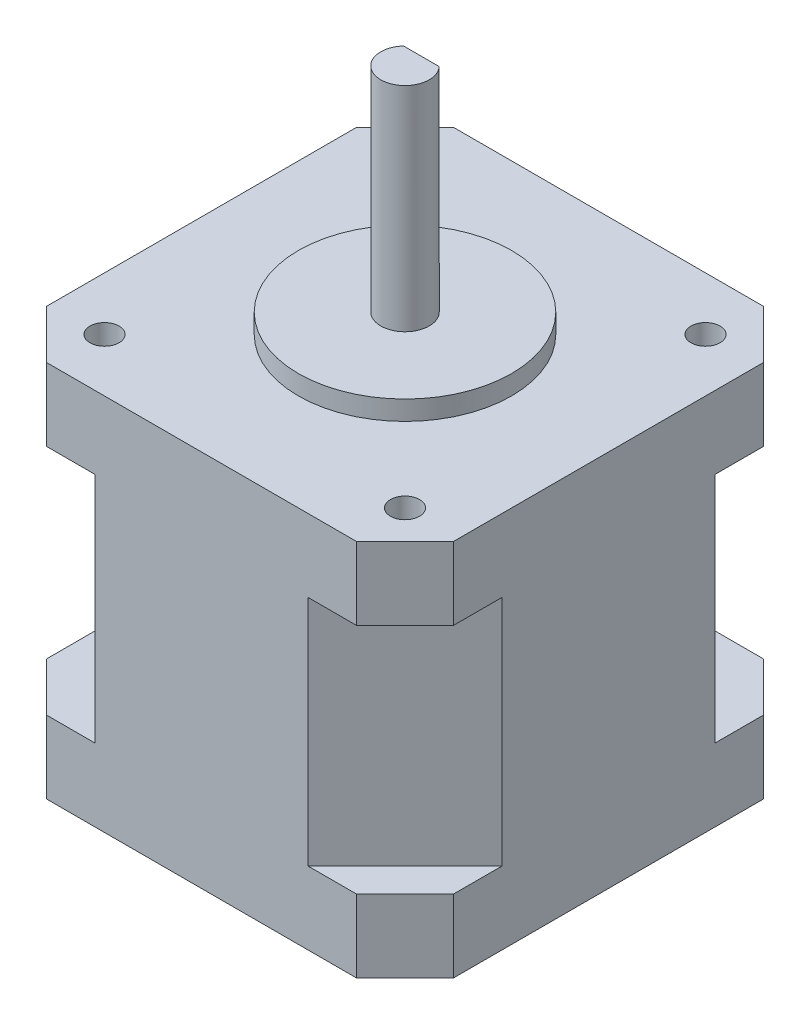
ISO-10303-21;
HEADER;
FILE_DESCRIPTION(('STEP AP214'),'2;1');
FILE_NAME('part.step','',(''),(''),'','','');
FILE_SCHEMA(('AUTOMOTIVE_DESIGN { 1 0 10303 214 1 1 1 1 }'));
ENDSEC;
DATA;
#1=APPLICATION_CONTEXT('core data for automotive mechanical design processes');
#2=APPLICATION_PROTOCOL_DEFINITION('international standard','automotive_design',2000,#1);
#3=PRODUCT_CONTEXT('',#1,'mechanical');
#4=PRODUCT('Part','Part','',(#3));
#5=PRODUCT_RELATED_PRODUCT_CATEGORY('part','',(#4));
#6=PRODUCT_DEFINITION_FORMATION('','',#4);
#7=PRODUCT_DEFINITION_CONTEXT('part definition',#1,'design');
#8=PRODUCT_DEFINITION('design','',#6,#7);
#9=PRODUCT_DEFINITION_SHAPE('','',#8);
#10=(LENGTH_UNIT() NAMED_UNIT(*) SI_UNIT(.MILLI.,.METRE.));
#11=(NAMED_UNIT(*) PLANE_ANGLE_UNIT() SI_UNIT($,.RADIAN.));
#12=(NAMED_UNIT(*) SI_UNIT($,.STERADIAN.) SOLID_ANGLE_UNIT());
#13=UNCERTAINTY_MEASURE_WITH_UNIT(LENGTH_MEASURE(1.E-05),#10,'distance_accuracy_value','');
#14=(GEOMETRIC_REPRESENTATION_CONTEXT(3) GLOBAL_UNCERTAINTY_ASSIGNED_CONTEXT((#13)) GLOBAL_UNIT_ASSIGNED_CONTEXT((#10,
#11,#12)) REPRESENTATION_CONTEXT('',''));
#15=CARTESIAN_POINT('',(0.,0.,0.));
#16=DIRECTION('',(0.,0.,1.));
#17=DIRECTION('',(1.,0.,0.));
#18=AXIS2_PLACEMENT_3D('',#15,#16,#17);
#19=CARTESIAN_POINT('',(0.,-7.5,0.));
#20=DIRECTION('',(0.,-1.,0.));
#21=DIRECTION('',(0.,0.,-1.));
#22=AXIS2_PLACEMENT_3D('',#19,#20,#21);
#23=PLANE('',#22);
#24=DIRECTION('',(-0.707106781186548,0.,-0.707106781186548));
#25=VECTOR('',#24,1.);
#26=CARTESIAN_POINT('',(-21.,-7.5,11.));
#27=LINE('',#26,#25);
#28=CARTESIAN_POINT('',(-11.,-7.5,21.));
#29=VERTEX_POINT('',#28);
#30=CARTESIAN_POINT('',(-21.,-7.5,11.));
#31=VERTEX_POINT('',#30);
#32=EDGE_CURVE('E352',#29,#31,#27,.T.);
#33=ORIENTED_EDGE('',*,*,#32,.F.);
#34=DIRECTION('',(1.,0.,0.));
#35=VECTOR('',#34,1.);
#36=CARTESIAN_POINT('',(-16.,-7.5,21.));
#37=LINE('',#36,#35);
#38=CARTESIAN_POINT('',(-16.,-7.5,21.));
#39=VERTEX_POINT('',#38);
#40=EDGE_CURVE('E419',#39,#29,#37,.T.);
#41=ORIENTED_EDGE('',*,*,#40,.F.);
#42=DIRECTION('',(0.707106781186548,0.,0.707106781186548));
#43=VECTOR('',#42,1.);
#44=CARTESIAN_POINT('',(-21.,-7.5,16.));
#45=LINE('',#44,#43);
#46=CARTESIAN_POINT('',(-21.,-7.5,16.));
#47=VERTEX_POINT('',#46);
#48=EDGE_CURVE('E414',#47,#39,#45,.T.);
#49=ORIENTED_EDGE('',*,*,#48,.F.);
#50=DIRECTION('',(0.,0.,1.));
#51=VECTOR('',#50,1.);
#52=CARTESIAN_POINT('',(-21.,-7.5,16.));
#53=LINE('',#52,#51);
#54=EDGE_CURVE('E415',#31,#47,#53,.T.);
#55=ORIENTED_EDGE('',*,*,#54,.F.);
#56=EDGE_LOOP('',(#33,#41,#49,#55));
#57=FACE_BOUND('',#56,.T.);
#58=ADVANCED_FACE('F51',(#57),#23,.T.);
#59=DIRECTION('',(-0.707106781186548,0.,0.707106781186547));
#60=VECTOR('',#59,1.);
#61=CARTESIAN_POINT('',(11.,-7.5,21.));
#62=LINE('',#61,#60);
#63=CARTESIAN_POINT('',(21.,-7.5,11.));
#64=VERTEX_POINT('',#63);
#65=CARTESIAN_POINT('',(11.,-7.5,21.));
#66=VERTEX_POINT('',#65);
#67=EDGE_CURVE('E372',#64,#66,#62,.T.);
#68=ORIENTED_EDGE('',*,*,#67,.F.);
#69=DIRECTION('',(0.,0.,-1.));
#70=VECTOR('',#69,1.);
#71=CARTESIAN_POINT('',(21.,-7.5,16.));
#72=LINE('',#71,#70);
#73=CARTESIAN_POINT('',(21.,-7.5,16.));
#74=VERTEX_POINT('',#73);
#75=EDGE_CURVE('E428',#74,#64,#72,.T.);
#76=ORIENTED_EDGE('',*,*,#75,.F.);
#77=DIRECTION('',(0.707106781186548,0.,-0.707106781186548));
#78=VECTOR('',#77,1.);
#79=CARTESIAN_POINT('',(16.,-7.5,21.));
#80=LINE('',#79,#78);
#81=CARTESIAN_POINT('',(16.,-7.5,21.));
#82=VERTEX_POINT('',#81);
#83=EDGE_CURVE('E423',#82,#74,#80,.T.);
#84=ORIENTED_EDGE('',*,*,#83,.F.);
#85=EDGE_CURVE('E75',#66,#82,#37,.T.);
#86=ORIENTED_EDGE('',*,*,#85,.F.);
#87=EDGE_LOOP('',(#68,#76,#84,#86));
#88=FACE_BOUND('',#87,.T.);
#89=ADVANCED_FACE('F583',(#88),#23,.T.);
#90=DIRECTION('',(0.707106781186547,0.,0.707106781186548));
#91=VECTOR('',#90,1.);
#92=CARTESIAN_POINT('',(11.,-7.5,-21.));
#93=LINE('',#92,#91);
#94=CARTESIAN_POINT('',(11.,-7.5,-21.));
#95=VERTEX_POINT('',#94);
#96=CARTESIAN_POINT('',(21.,-7.5,-11.));
#97=VERTEX_POINT('',#96);
#98=EDGE_CURVE('E368',#95,#97,#93,.T.);
#99=ORIENTED_EDGE('',*,*,#98,.F.);
#100=DIRECTION('',(-1.,0.,0.));
#101=VECTOR('',#100,1.);
#102=CARTESIAN_POINT('',(-16.,-7.5,-21.));
#103=LINE('',#102,#101);
#104=CARTESIAN_POINT('',(16.,-7.5,-21.));
#105=VERTEX_POINT('',#104);
#106=EDGE_CURVE('E437',#105,#95,#103,.T.);
#107=ORIENTED_EDGE('',*,*,#106,.F.);
#108=DIRECTION('',(-0.707106781186548,0.,-0.707106781186548));
#109=VECTOR('',#108,1.);
#110=CARTESIAN_POINT('',(16.,-7.5,-21.));
#111=LINE('',#110,#109);
#112=CARTESIAN_POINT('',(21.,-7.5,-16.));
#113=VERTEX_POINT('',#112);
#114=EDGE_CURVE('E432',#113,#105,#111,.T.);
#115=ORIENTED_EDGE('',*,*,#114,.F.);
#116=EDGE_CURVE('E427',#97,#113,#72,.T.);
#117=ORIENTED_EDGE('',*,*,#116,.F.);
#118=EDGE_LOOP('',(#99,#107,#115,#117));
#119=FACE_BOUND('',#118,.T.);
#120=ADVANCED_FACE('F549',(#119),#23,.T.);
#121=CARTESIAN_POINT('',(-21.,-7.5,16.));
#122=DIRECTION('',(-1.,0.,0.));
#123=DIRECTION('',(0.,0.,1.));
#124=AXIS2_PLACEMENT_3D('',#121,#122,#123);
#125=PLANE('',#124);
#126=DIRECTION('',(0.,0.,1.));
#127=VECTOR('',#126,1.);
#128=CARTESIAN_POINT('',(-21.,0.,16.));
#129=LINE('',#128,#127);
#130=CARTESIAN_POINT('',(-21.,0.,-16.));
#131=VERTEX_POINT('',#130);
#132=CARTESIAN_POINT('',(-21.,0.,16.));
#133=VERTEX_POINT('',#132);
#134=EDGE_CURVE('E409',#131,#133,#129,.T.);
#135=ORIENTED_EDGE('',*,*,#134,.F.);
#136=DIRECTION('',(0.,1.,0.));
#137=VECTOR('',#136,1.);
#138=CARTESIAN_POINT('',(-21.,-7.5,-16.));
#139=LINE('',#138,#137);
#140=CARTESIAN_POINT('',(-21.,-7.5,-16.));
#141=VERTEX_POINT('',#140);
#142=EDGE_CURVE('E257',#141,#131,#139,.T.);
#143=ORIENTED_EDGE('',*,*,#142,.F.);
#144=CARTESIAN_POINT('',(-21.,-7.5,-11.));
#145=VERTEX_POINT('',#144);
#146=EDGE_CURVE('E410',#141,#145,#53,.T.);
#147=ORIENTED_EDGE('',*,*,#146,.T.);
#148=DIRECTION('',(0.,1.,0.));
#149=VECTOR('',#148,1.);
#150=CARTESIAN_POINT('',(-21.,-31.5,-11.));
#151=LINE('',#150,#149);
#152=CARTESIAN_POINT('',(-21.,-31.5,-11.));
#153=VERTEX_POINT('',#152);
#154=EDGE_CURVE('E405',#153,#145,#151,.T.);
#155=ORIENTED_EDGE('',*,*,#154,.F.);
#156=DIRECTION('',(0.,0.,-1.));
#157=VECTOR('',#156,1.);
#158=CARTESIAN_POINT('',(-21.,-31.5,-16.));
#159=LINE('',#158,#157);
#160=CARTESIAN_POINT('',(-21.,-31.5,-16.));
#161=VERTEX_POINT('',#160);
#162=EDGE_CURVE('E246',#153,#161,#159,.T.);
#163=ORIENTED_EDGE('',*,*,#162,.T.);
#164=DIRECTION('',(0.,1.,0.));
#165=VECTOR('',#164,1.);
#166=CARTESIAN_POINT('',(-21.,-39.,-16.));
#167=LINE('',#166,#165);
#168=CARTESIAN_POINT('',(-21.,-39.,-16.));
#169=VERTEX_POINT('',#168);
#170=EDGE_CURVE('E342',#169,#161,#167,.T.);
#171=ORIENTED_EDGE('',*,*,#170,.F.);
#172=DIRECTION('',(0.,0.,-1.));
#173=VECTOR('',#172,1.);
#174=CARTESIAN_POINT('',(-21.,-39.,-16.));
#175=LINE('',#174,#173);
#176=CARTESIAN_POINT('',(-21.,-39.,16.));
#177=VERTEX_POINT('',#176);
#178=EDGE_CURVE('E258',#177,#169,#175,.T.);
#179=ORIENTED_EDGE('',*,*,#178,.F.);
#180=DIRECTION('',(0.,1.,0.));
#181=VECTOR('',#180,1.);
#182=CARTESIAN_POINT('',(-21.,-39.,16.));
#183=LINE('',#182,#181);
#184=CARTESIAN_POINT('',(-21.,-31.5,16.));
#185=VERTEX_POINT('',#184);
#186=EDGE_CURVE('E284',#177,#185,#183,.T.);
#187=ORIENTED_EDGE('',*,*,#186,.T.);
#188=CARTESIAN_POINT('',(-21.,-31.5,11.));
#189=VERTEX_POINT('',#188);
#190=EDGE_CURVE('E285',#185,#189,#159,.T.);
#191=ORIENTED_EDGE('',*,*,#190,.T.);
#192=DIRECTION('',(0.,1.,0.));
#193=VECTOR('',#192,1.);
#194=CARTESIAN_POINT('',(-21.,-31.5,11.));
#195=LINE('',#194,#193);
#196=EDGE_CURVE('E364',#189,#31,#195,.T.);
#197=ORIENTED_EDGE('',*,*,#196,.T.);
#198=ORIENTED_EDGE('',*,*,#54,.T.);
#199=DIRECTION('',(0.,1.,0.));
#200=VECTOR('',#199,1.);
#201=CARTESIAN_POINT('',(-21.,-7.5,16.));
#202=LINE('',#201,#200);
#203=EDGE_CURVE('E445',#47,#133,#202,.T.);
#204=ORIENTED_EDGE('',*,*,#203,.T.);
#205=EDGE_LOOP('',(#135,#143,#147,#155,#163,#171,#179,#187,#191,#197,#198,#204));
#206=FACE_BOUND('',#205,.T.);
#207=ADVANCED_FACE('F53',(#206),#125,.T.);
#208=CARTESIAN_POINT('',(-21.,-7.5,-16.));
#209=DIRECTION('',(-0.707106781186549,0.,-0.707106781186546));
#210=DIRECTION('',(-0.707106781186546,0.,0.707106781186549));
#211=AXIS2_PLACEMENT_3D('',#208,#209,#210);
#212=PLANE('',#211);
#213=DIRECTION('',(-0.707106781186546,0.,0.707106781186549));
#214=VECTOR('',#213,1.);
#215=CARTESIAN_POINT('',(-21.,0.,-16.));
#216=LINE('',#215,#214);
#217=CARTESIAN_POINT('',(-16.,0.,-21.));
#218=VERTEX_POINT('',#217);
#219=EDGE_CURVE('E473',#218,#131,#216,.T.);
#220=ORIENTED_EDGE('',*,*,#219,.F.);
#221=DIRECTION('',(0.,1.,0.));
#222=VECTOR('',#221,1.);
#223=CARTESIAN_POINT('',(-16.,-7.5,-21.));
#224=LINE('',#223,#222);
#225=CARTESIAN_POINT('',(-16.,-7.5,-21.));
#226=VERTEX_POINT('',#225);
#227=EDGE_CURVE('E479',#226,#218,#224,.T.);
#228=ORIENTED_EDGE('',*,*,#227,.F.);
#229=DIRECTION('',(-0.707106781186546,0.,0.707106781186549));
#230=VECTOR('',#229,1.);
#231=CARTESIAN_POINT('',(-21.,-7.5,-16.));
#232=LINE('',#231,#230);
#233=EDGE_CURVE('E441',#226,#141,#232,.T.);
#234=ORIENTED_EDGE('',*,*,#233,.T.);
#235=ORIENTED_EDGE('',*,*,#142,.T.);
#236=EDGE_LOOP('',(#220,#228,#234,#235));
#237=FACE_BOUND('',#236,.T.);
#238=ADVANCED_FACE('F512',(#237),#212,.T.);
#239=CARTESIAN_POINT('',(-16.,-7.5,-21.));
#240=DIRECTION('',(0.,0.,-1.));
#241=DIRECTION('',(-1.,0.,0.));
#242=AXIS2_PLACEMENT_3D('',#239,#240,#241);
#243=PLANE('',#242);
#244=DIRECTION('',(-1.,0.,0.));
#245=VECTOR('',#244,1.);
#246=CARTESIAN_POINT('',(-16.,0.,-21.));
#247=LINE('',#246,#245);
#248=CARTESIAN_POINT('',(16.,0.,-21.));
#249=VERTEX_POINT('',#248);
#250=EDGE_CURVE('E469',#249,#218,#247,.T.);
#251=ORIENTED_EDGE('',*,*,#250,.F.);
#252=DIRECTION('',(0.,1.,0.));
#253=VECTOR('',#252,1.);
#254=CARTESIAN_POINT('',(16.,-7.5,-21.));
#255=LINE('',#254,#253);
#256=EDGE_CURVE('E482',#105,#249,#255,.T.);
#257=ORIENTED_EDGE('',*,*,#256,.F.);
#258=ORIENTED_EDGE('',*,*,#106,.T.);
#259=DIRECTION('',(0.,1.,0.));
#260=VECTOR('',#259,1.);
#261=CARTESIAN_POINT('',(11.,-31.5,-21.));
#262=LINE('',#261,#260);
#263=CARTESIAN_POINT('',(11.,-31.5,-21.));
#264=VERTEX_POINT('',#263);
#265=EDGE_CURVE('E397',#264,#95,#262,.T.);
#266=ORIENTED_EDGE('',*,*,#265,.F.);
#267=DIRECTION('',(1.,0.,0.));
#268=VECTOR('',#267,1.);
#269=CARTESIAN_POINT('',(-16.,-31.5,-21.));
#270=LINE('',#269,#268);
#271=CARTESIAN_POINT('',(16.,-31.5,-21.));
#272=VERTEX_POINT('',#271);
#273=EDGE_CURVE('E292',#264,#272,#270,.T.);
#274=ORIENTED_EDGE('',*,*,#273,.T.);
#275=DIRECTION('',(0.,1.,0.));
#276=VECTOR('',#275,1.);
#277=CARTESIAN_POINT('',(16.,-39.,-21.));
#278=LINE('',#277,#276);
#279=CARTESIAN_POINT('',(16.,-39.,-21.));
#280=VERTEX_POINT('',#279);
#281=EDGE_CURVE('E334',#280,#272,#278,.T.);
#282=ORIENTED_EDGE('',*,*,#281,.F.);
#283=DIRECTION('',(1.,0.,0.));
#284=VECTOR('',#283,1.);
#285=CARTESIAN_POINT('',(-16.,-39.,-21.));
#286=LINE('',#285,#284);
#287=CARTESIAN_POINT('',(-16.,-39.,-21.));
#288=VERTEX_POINT('',#287);
#289=EDGE_CURVE('E266',#288,#280,#286,.T.);
#290=ORIENTED_EDGE('',*,*,#289,.F.);
#291=DIRECTION('',(0.,1.,0.));
#292=VECTOR('',#291,1.);
#293=CARTESIAN_POINT('',(-16.,-39.,-21.));
#294=LINE('',#293,#292);
#295=CARTESIAN_POINT('',(-16.,-31.5,-21.));
#296=VERTEX_POINT('',#295);
#297=EDGE_CURVE('E338',#288,#296,#294,.T.);
#298=ORIENTED_EDGE('',*,*,#297,.T.);
#299=CARTESIAN_POINT('',(-11.,-31.5,-21.));
#300=VERTEX_POINT('',#299);
#301=EDGE_CURVE('E293',#296,#300,#270,.T.);
#302=ORIENTED_EDGE('',*,*,#301,.T.);
#303=DIRECTION('',(0.,1.,0.));
#304=VECTOR('',#303,1.);
#305=CARTESIAN_POINT('',(-11.,-31.5,-21.));
#306=LINE('',#305,#304);
#307=CARTESIAN_POINT('',(-11.,-7.5,-21.));
#308=VERTEX_POINT('',#307);
#309=EDGE_CURVE('E401',#300,#308,#306,.T.);
#310=ORIENTED_EDGE('',*,*,#309,.T.);
#311=EDGE_CURVE('E436',#308,#226,#103,.T.);
#312=ORIENTED_EDGE('',*,*,#311,.T.);
#313=ORIENTED_EDGE('',*,*,#227,.T.);
#314=EDGE_LOOP('',(#251,#257,#258,#266,#274,#282,#290,#298,#302,#310,#312,#313));
#315=FACE_BOUND('',#314,.T.);
#316=ADVANCED_FACE('F521',(#315),#243,.T.);
#317=CARTESIAN_POINT('',(16.,-7.5,-21.));
#318=DIRECTION('',(0.707106781186547,0.,-0.707106781186547));
#319=DIRECTION('',(-0.707106781186548,0.,-0.707106781186548));
#320=AXIS2_PLACEMENT_3D('',#317,#318,#319);
#321=PLANE('',#320);
#322=DIRECTION('',(-0.707106781186548,0.,-0.707106781186548));
#323=VECTOR('',#322,1.);
#324=CARTESIAN_POINT('',(16.,0.,-21.));
#325=LINE('',#324,#323);
#326=CARTESIAN_POINT('',(21.,0.,-16.));
#327=VERTEX_POINT('',#326);
#328=EDGE_CURVE('E465',#327,#249,#325,.T.);
#329=ORIENTED_EDGE('',*,*,#328,.F.);
#330=DIRECTION('',(0.,1.,0.));
#331=VECTOR('',#330,1.);
#332=CARTESIAN_POINT('',(21.,-7.5,-16.));
#333=LINE('',#332,#331);
#334=EDGE_CURVE('E485',#113,#327,#333,.T.);
#335=ORIENTED_EDGE('',*,*,#334,.F.);
#336=ORIENTED_EDGE('',*,*,#114,.T.);
#337=ORIENTED_EDGE('',*,*,#256,.T.);
#338=EDGE_LOOP('',(#329,#335,#336,#337));
#339=FACE_BOUND('',#338,.T.);
#340=ADVANCED_FACE('F547',(#339),#321,.T.);
#341=CARTESIAN_POINT('',(21.,-7.5,16.));
#342=DIRECTION('',(1.,0.,0.));
#343=DIRECTION('',(0.,0.,-1.));
#344=AXIS2_PLACEMENT_3D('',#341,#342,#343);
#345=PLANE('',#344);
#346=DIRECTION('',(0.,0.,-1.));
#347=VECTOR('',#346,1.);
#348=CARTESIAN_POINT('',(21.,0.,16.));
#349=LINE('',#348,#347);
#350=CARTESIAN_POINT('',(21.,0.,16.));
#351=VERTEX_POINT('',#350);
#352=EDGE_CURVE('E461',#351,#327,#349,.T.);
#353=ORIENTED_EDGE('',*,*,#352,.F.);
#354=DIRECTION('',(0.,1.,0.));
#355=VECTOR('',#354,1.);
#356=CARTESIAN_POINT('',(21.,-7.5,16.));
#357=LINE('',#356,#355);
#358=EDGE_CURVE('E488',#74,#351,#357,.T.);
#359=ORIENTED_EDGE('',*,*,#358,.F.);
#360=ORIENTED_EDGE('',*,*,#75,.T.);
#361=DIRECTION('',(0.,1.,0.));
#362=VECTOR('',#361,1.);
#363=CARTESIAN_POINT('',(21.,-31.5,11.));
#364=LINE('',#363,#362);
#365=CARTESIAN_POINT('',(21.,-31.5,11.));
#366=VERTEX_POINT('',#365);
#367=EDGE_CURVE('E389',#366,#64,#364,.T.);
#368=ORIENTED_EDGE('',*,*,#367,.F.);
#369=DIRECTION('',(0.,0.,1.));
#370=VECTOR('',#369,1.);
#371=CARTESIAN_POINT('',(21.,-31.5,-16.));
#372=LINE('',#371,#370);
#373=CARTESIAN_POINT('',(21.,-31.5,16.));
#374=VERTEX_POINT('',#373);
#375=EDGE_CURVE('E300',#366,#374,#372,.T.);
#376=ORIENTED_EDGE('',*,*,#375,.T.);
#377=DIRECTION('',(0.,1.,0.));
#378=VECTOR('',#377,1.);
#379=CARTESIAN_POINT('',(21.,-39.,16.));
#380=LINE('',#379,#378);
#381=CARTESIAN_POINT('',(21.,-39.,16.));
#382=VERTEX_POINT('',#381);
#383=EDGE_CURVE('E326',#382,#374,#380,.T.);
#384=ORIENTED_EDGE('',*,*,#383,.F.);
#385=DIRECTION('',(0.,0.,1.));
#386=VECTOR('',#385,1.);
#387=CARTESIAN_POINT('',(21.,-39.,-16.));
#388=LINE('',#387,#386);
#389=CARTESIAN_POINT('',(21.,-39.,-16.));
#390=VERTEX_POINT('',#389);
#391=EDGE_CURVE('E272',#390,#382,#388,.T.);
#392=ORIENTED_EDGE('',*,*,#391,.F.);
#393=DIRECTION('',(0.,1.,0.));
#394=VECTOR('',#393,1.);
#395=CARTESIAN_POINT('',(21.,-39.,-16.));
#396=LINE('',#395,#394);
#397=CARTESIAN_POINT('',(21.,-31.5,-16.));
#398=VERTEX_POINT('',#397);
#399=EDGE_CURVE('E330',#390,#398,#396,.T.);
#400=ORIENTED_EDGE('',*,*,#399,.T.);
#401=CARTESIAN_POINT('',(21.,-31.5,-11.));
#402=VERTEX_POINT('',#401);
#403=EDGE_CURVE('E301',#398,#402,#372,.T.);
#404=ORIENTED_EDGE('',*,*,#403,.T.);
#405=DIRECTION('',(0.,1.,0.));
#406=VECTOR('',#405,1.);
#407=CARTESIAN_POINT('',(21.,-31.5,-11.));
#408=LINE('',#407,#406);
#409=EDGE_CURVE('E393',#402,#97,#408,.T.);
#410=ORIENTED_EDGE('',*,*,#409,.T.);
#411=ORIENTED_EDGE('',*,*,#116,.T.);
#412=ORIENTED_EDGE('',*,*,#334,.T.);
#413=EDGE_LOOP('',(#353,#359,#360,#368,#376,#384,#392,#400,#404,#410,#411,#412));
#414=FACE_BOUND('',#413,.T.);
#415=ADVANCED_FACE('F542',(#414),#345,.T.);
#416=CARTESIAN_POINT('',(16.,-7.5,21.));
#417=DIRECTION('',(0.707106781186547,0.,0.707106781186547));
#418=DIRECTION('',(0.707106781186548,0.,-0.707106781186548));
#419=AXIS2_PLACEMENT_3D('',#416,#417,#418);
#420=PLANE('',#419);
#421=DIRECTION('',(0.707106781186548,0.,-0.707106781186548));
#422=VECTOR('',#421,1.);
#423=CARTESIAN_POINT('',(16.,0.,21.));
#424=LINE('',#423,#422);
#425=CARTESIAN_POINT('',(16.,0.,21.));
#426=VERTEX_POINT('',#425);
#427=EDGE_CURVE('E457',#426,#351,#424,.T.);
#428=ORIENTED_EDGE('',*,*,#427,.F.);
#429=DIRECTION('',(0.,1.,0.));
#430=VECTOR('',#429,1.);
#431=CARTESIAN_POINT('',(16.,-7.5,21.));
#432=LINE('',#431,#430);
#433=EDGE_CURVE('E491',#82,#426,#432,.T.);
#434=ORIENTED_EDGE('',*,*,#433,.F.);
#435=ORIENTED_EDGE('',*,*,#83,.T.);
#436=ORIENTED_EDGE('',*,*,#358,.T.);
#437=EDGE_LOOP('',(#428,#434,#435,#436));
#438=FACE_BOUND('',#437,.T.);
#439=ADVANCED_FACE('F615',(#438),#420,.T.);
#440=CARTESIAN_POINT('',(-16.,-7.5,21.));
#441=DIRECTION('',(0.,0.,1.));
#442=DIRECTION('',(1.,0.,0.));
#443=AXIS2_PLACEMENT_3D('',#440,#441,#442);
#444=PLANE('',#443);
#445=DIRECTION('',(1.,0.,0.));
#446=VECTOR('',#445,1.);
#447=CARTESIAN_POINT('',(-16.,0.,21.));
#448=LINE('',#447,#446);
#449=CARTESIAN_POINT('',(-16.,0.,21.));
#450=VERTEX_POINT('',#449);
#451=EDGE_CURVE('E453',#450,#426,#448,.T.);
#452=ORIENTED_EDGE('',*,*,#451,.F.);
#453=DIRECTION('',(0.,1.,0.));
#454=VECTOR('',#453,1.);
#455=CARTESIAN_POINT('',(-16.,-7.5,21.));
#456=LINE('',#455,#454);
#457=EDGE_CURVE('E494',#39,#450,#456,.T.);
#458=ORIENTED_EDGE('',*,*,#457,.F.);
#459=ORIENTED_EDGE('',*,*,#40,.T.);
#460=DIRECTION('',(0.,1.,0.));
#461=VECTOR('',#460,1.);
#462=CARTESIAN_POINT('',(-11.,-31.5,21.));
#463=LINE('',#462,#461);
#464=CARTESIAN_POINT('',(-11.,-31.5,21.));
#465=VERTEX_POINT('',#464);
#466=EDGE_CURVE('E381',#465,#29,#463,.T.);
#467=ORIENTED_EDGE('',*,*,#466,.F.);
#468=DIRECTION('',(-1.,0.,0.));
#469=VECTOR('',#468,1.);
#470=CARTESIAN_POINT('',(-16.,-31.5,21.));
#471=LINE('',#470,#469);
#472=CARTESIAN_POINT('',(-16.,-31.5,21.));
#473=VERTEX_POINT('',#472);
#474=EDGE_CURVE('E308',#465,#473,#471,.T.);
#475=ORIENTED_EDGE('',*,*,#474,.T.);
#476=DIRECTION('',(0.,1.,0.));
#477=VECTOR('',#476,1.);
#478=CARTESIAN_POINT('',(-16.,-39.,21.));
#479=LINE('',#478,#477);
#480=CARTESIAN_POINT('',(-16.,-39.,21.));
#481=VERTEX_POINT('',#480);
#482=EDGE_CURVE('E318',#481,#473,#479,.T.);
#483=ORIENTED_EDGE('',*,*,#482,.F.);
#484=DIRECTION('',(-1.,0.,0.));
#485=VECTOR('',#484,1.);
#486=CARTESIAN_POINT('',(-16.,-39.,21.));
#487=LINE('',#486,#485);
#488=CARTESIAN_POINT('',(16.,-39.,21.));
#489=VERTEX_POINT('',#488);
#490=EDGE_CURVE('E278',#489,#481,#487,.T.);
#491=ORIENTED_EDGE('',*,*,#490,.F.);
#492=DIRECTION('',(0.,1.,0.));
#493=VECTOR('',#492,1.);
#494=CARTESIAN_POINT('',(16.,-39.,21.));
#495=LINE('',#494,#493);
#496=CARTESIAN_POINT('',(16.,-31.5,21.));
#497=VERTEX_POINT('',#496);
#498=EDGE_CURVE('E322',#489,#497,#495,.T.);
#499=ORIENTED_EDGE('',*,*,#498,.T.);
#500=CARTESIAN_POINT('',(11.,-31.5,21.));
#501=VERTEX_POINT('',#500);
#502=EDGE_CURVE('E309',#497,#501,#471,.T.);
#503=ORIENTED_EDGE('',*,*,#502,.T.);
#504=DIRECTION('',(0.,1.,0.));
#505=VECTOR('',#504,1.);
#506=CARTESIAN_POINT('',(11.,-31.5,21.));
#507=LINE('',#506,#505);
#508=EDGE_CURVE('E385',#501,#66,#507,.T.);
#509=ORIENTED_EDGE('',*,*,#508,.T.);
#510=ORIENTED_EDGE('',*,*,#85,.T.);
#511=ORIENTED_EDGE('',*,*,#433,.T.);
#512=EDGE_LOOP('',(#452,#458,#459,#467,#475,#483,#491,#499,#503,#509,#510,#511));
#513=FACE_BOUND('',#512,.T.);
#514=ADVANCED_FACE('F597',(#513),#444,.T.);
#515=CARTESIAN_POINT('',(-21.,-7.5,16.));
#516=DIRECTION('',(-0.707106781186547,0.,0.707106781186547));
#517=DIRECTION('',(0.707106781186548,0.,0.707106781186548));
#518=AXIS2_PLACEMENT_3D('',#515,#516,#517);
#519=PLANE('',#518);
#520=DIRECTION('',(0.707106781186548,0.,0.707106781186548));
#521=VECTOR('',#520,1.);
#522=CARTESIAN_POINT('',(-21.,0.,16.));
#523=LINE('',#522,#521);
#524=EDGE_CURVE('E449',#133,#450,#523,.T.);
#525=ORIENTED_EDGE('',*,*,#524,.F.);
#526=ORIENTED_EDGE('',*,*,#203,.F.);
#527=ORIENTED_EDGE('',*,*,#48,.T.);
#528=ORIENTED_EDGE('',*,*,#457,.T.);
#529=EDGE_LOOP('',(#525,#526,#527,#528));
#530=FACE_BOUND('',#529,.T.);
#531=ADVANCED_FACE('F504',(#530),#519,.T.);
#532=DIRECTION('',(0.707106781186548,0.,-0.707106781186548));
#533=VECTOR('',#532,1.);
#534=CARTESIAN_POINT('',(-21.,-7.5,-11.));
#535=LINE('',#534,#533);
#536=EDGE_CURVE('E346',#145,#308,#535,.T.);
#537=ORIENTED_EDGE('',*,*,#536,.F.);
#538=ORIENTED_EDGE('',*,*,#146,.F.);
#539=ORIENTED_EDGE('',*,*,#233,.F.);
#540=ORIENTED_EDGE('',*,*,#311,.F.);
#541=EDGE_LOOP('',(#537,#538,#539,#540));
#542=FACE_BOUND('',#541,.T.);
#543=ADVANCED_FACE('F517',(#542),#23,.T.);
#544=CARTESIAN_POINT('',(0.,0.,0.));
#545=DIRECTION('',(0.,-1.,0.));
#546=DIRECTION('',(0.,0.,-1.));
#547=AXIS2_PLACEMENT_3D('',#544,#545,#546);
#548=PLANE('',#547);
#549=CARTESIAN_POINT('',(-15.5000000000002,0.,15.4999999999998));
#550=DIRECTION('',(0.,1.,0.));
#551=DIRECTION('',(0.,0.,1.));
#552=AXIS2_PLACEMENT_3D('',#549,#550,#551);
#553=CIRCLE('',#552,1.5);
#554=CARTESIAN_POINT('',(-15.5000000000002,0.,16.9999999999998));
#555=VERTEX_POINT('',#554);
#556=EDGE_CURVE('E1130',#555,#555,#553,.T.);
#557=ORIENTED_EDGE('',*,*,#556,.F.);
#558=EDGE_LOOP('',(#557));
#559=FACE_BOUND('',#558,.T.);
#560=CARTESIAN_POINT('',(15.4999999999999,0.,15.5000000000001));
#561=DIRECTION('',(0.,1.,0.));
#562=DIRECTION('',(0.,0.,1.));
#563=AXIS2_PLACEMENT_3D('',#560,#561,#562);
#564=CIRCLE('',#563,1.5);
#565=CARTESIAN_POINT('',(15.4999999999999,0.,17.0000000000001));
#566=VERTEX_POINT('',#565);
#567=EDGE_CURVE('E1155',#566,#566,#564,.T.);
#568=ORIENTED_EDGE('',*,*,#567,.F.);
#569=EDGE_LOOP('',(#568));
#570=FACE_BOUND('',#569,.T.);
#571=CARTESIAN_POINT('',(15.5000000000001,0.,-15.4999999999999));
#572=DIRECTION('',(0.,1.,0.));
#573=DIRECTION('',(0.,0.,1.));
#574=AXIS2_PLACEMENT_3D('',#571,#572,#573);
#575=CIRCLE('',#574,1.5);
#576=CARTESIAN_POINT('',(15.5000000000001,0.,-13.9999999999999));
#577=VERTEX_POINT('',#576);
#578=EDGE_CURVE('E1146',#577,#577,#575,.T.);
#579=ORIENTED_EDGE('',*,*,#578,.F.);
#580=EDGE_LOOP('',(#579));
#581=FACE_BOUND('',#580,.T.);
#582=CARTESIAN_POINT('',(-15.5,0.,-15.5));
#583=DIRECTION('',(0.,1.,0.));
#584=DIRECTION('',(0.,0.,1.));
#585=AXIS2_PLACEMENT_3D('',#582,#583,#584);
#586=CIRCLE('',#585,1.5);
#587=CARTESIAN_POINT('',(-15.5,0.,-14.));
#588=VERTEX_POINT('',#587);
#589=EDGE_CURVE('E1142',#588,#588,#586,.T.);
#590=ORIENTED_EDGE('',*,*,#589,.F.);
#591=EDGE_LOOP('',(#590));
#592=FACE_BOUND('',#591,.T.);
#593=CARTESIAN_POINT('',(0.,0.,0.));
#594=DIRECTION('',(0.,1.,0.));
#595=DIRECTION('',(0.,0.,1.));
#596=AXIS2_PLACEMENT_3D('',#593,#594,#595);
#597=CIRCLE('',#596,11.);
#598=CARTESIAN_POINT('',(0.,0.,11.));
#599=VERTEX_POINT('',#598);
#600=EDGE_CURVE('E252',#599,#599,#597,.T.);
#601=ORIENTED_EDGE('',*,*,#600,.F.);
#602=EDGE_LOOP('',(#601));
#603=FACE_BOUND('',#602,.T.);
#604=ORIENTED_EDGE('',*,*,#134,.T.);
#605=ORIENTED_EDGE('',*,*,#524,.T.);
#606=ORIENTED_EDGE('',*,*,#451,.T.);
#607=ORIENTED_EDGE('',*,*,#427,.T.);
#608=ORIENTED_EDGE('',*,*,#352,.T.);
#609=ORIENTED_EDGE('',*,*,#328,.T.);
#610=ORIENTED_EDGE('',*,*,#250,.T.);
#611=ORIENTED_EDGE('',*,*,#219,.T.);
#612=EDGE_LOOP('',(#604,#605,#606,#607,#608,#609,#610,#611));
#613=FACE_BOUND('',#612,.T.);
#614=ADVANCED_FACE('F507',(#559,#570,#581,#592,#603,#613),#548,.F.);
#615=CARTESIAN_POINT('',(-21.,-31.5,-11.));
#616=DIRECTION('',(0.707106781186547,0.,0.707106781186547));
#617=DIRECTION('',(0.707106781186548,0.,-0.707106781186548));
#618=AXIS2_PLACEMENT_3D('',#615,#616,#617);
#619=PLANE('',#618);
#620=ORIENTED_EDGE('',*,*,#536,.T.);
#621=ORIENTED_EDGE('',*,*,#309,.F.);
#622=DIRECTION('',(0.707106781186548,0.,-0.707106781186548));
#623=VECTOR('',#622,1.);
#624=CARTESIAN_POINT('',(-21.,-31.5,-11.));
#625=LINE('',#624,#623);
#626=EDGE_CURVE('E347',#153,#300,#625,.T.);
#627=ORIENTED_EDGE('',*,*,#626,.F.);
#628=ORIENTED_EDGE('',*,*,#154,.T.);
#629=EDGE_LOOP('',(#620,#621,#627,#628));
#630=FACE_BOUND('',#629,.T.);
#631=ADVANCED_FACE('F519',(#630),#619,.F.);
#632=CARTESIAN_POINT('',(11.,-31.5,-21.));
#633=DIRECTION('',(-0.707106781186548,0.,0.707106781186547));
#634=DIRECTION('',(0.707106781186547,0.,0.707106781186548));
#635=AXIS2_PLACEMENT_3D('',#632,#633,#634);
#636=PLANE('',#635);
#637=ORIENTED_EDGE('',*,*,#98,.T.);
#638=ORIENTED_EDGE('',*,*,#409,.F.);
#639=DIRECTION('',(0.707106781186547,0.,0.707106781186548));
#640=VECTOR('',#639,1.);
#641=CARTESIAN_POINT('',(11.,-31.5,-21.));
#642=LINE('',#641,#640);
#643=EDGE_CURVE('E351',#264,#402,#642,.T.);
#644=ORIENTED_EDGE('',*,*,#643,.F.);
#645=ORIENTED_EDGE('',*,*,#265,.T.);
#646=EDGE_LOOP('',(#637,#638,#644,#645));
#647=FACE_BOUND('',#646,.T.);
#648=ADVANCED_FACE('F552',(#647),#636,.F.);
#649=CARTESIAN_POINT('',(11.,-31.5,21.));
#650=DIRECTION('',(-0.707106781186547,0.,-0.707106781186548));
#651=DIRECTION('',(-0.707106781186548,0.,0.707106781186547));
#652=AXIS2_PLACEMENT_3D('',#649,#650,#651);
#653=PLANE('',#652);
#654=ORIENTED_EDGE('',*,*,#67,.T.);
#655=ORIENTED_EDGE('',*,*,#508,.F.);
#656=DIRECTION('',(-0.707106781186548,0.,0.707106781186547));
#657=VECTOR('',#656,1.);
#658=CARTESIAN_POINT('',(11.,-31.5,21.));
#659=LINE('',#658,#657);
#660=EDGE_CURVE('E356',#366,#501,#659,.T.);
#661=ORIENTED_EDGE('',*,*,#660,.F.);
#662=ORIENTED_EDGE('',*,*,#367,.T.);
#663=EDGE_LOOP('',(#654,#655,#661,#662));
#664=FACE_BOUND('',#663,.T.);
#665=ADVANCED_FACE('F628',(#664),#653,.F.);
#666=CARTESIAN_POINT('',(-21.,-31.5,11.));
#667=DIRECTION('',(0.707106781186547,0.,-0.707106781186547));
#668=DIRECTION('',(-0.707106781186548,0.,-0.707106781186548));
#669=AXIS2_PLACEMENT_3D('',#666,#667,#668);
#670=PLANE('',#669);
#671=ORIENTED_EDGE('',*,*,#32,.T.);
#672=ORIENTED_EDGE('',*,*,#196,.F.);
#673=DIRECTION('',(-0.707106781186548,0.,-0.707106781186548));
#674=VECTOR('',#673,1.);
#675=CARTESIAN_POINT('',(-21.,-31.5,11.));
#676=LINE('',#675,#674);
#677=EDGE_CURVE('E360',#465,#189,#676,.T.);
#678=ORIENTED_EDGE('',*,*,#677,.F.);
#679=ORIENTED_EDGE('',*,*,#466,.T.);
#680=EDGE_LOOP('',(#671,#672,#678,#679));
#681=FACE_BOUND('',#680,.T.);
#682=ADVANCED_FACE('F648',(#681),#670,.F.);
#683=CARTESIAN_POINT('',(0.,-31.5,0.));
#684=DIRECTION('',(0.,1.,0.));
#685=DIRECTION('',(0.,0.,1.));
#686=AXIS2_PLACEMENT_3D('',#683,#684,#685);
#687=PLANE('',#686);
#688=ORIENTED_EDGE('',*,*,#162,.F.);
#689=ORIENTED_EDGE('',*,*,#626,.T.);
#690=ORIENTED_EDGE('',*,*,#301,.F.);
#691=DIRECTION('',(0.707106781186548,0.,-0.707106781186548));
#692=VECTOR('',#691,1.);
#693=CARTESIAN_POINT('',(-21.,-31.5,-16.));
#694=LINE('',#693,#692);
#695=EDGE_CURVE('E289',#161,#296,#694,.T.);
#696=ORIENTED_EDGE('',*,*,#695,.F.);
#697=EDGE_LOOP('',(#688,#689,#690,#696));
#698=FACE_BOUND('',#697,.T.);
#699=ADVANCED_FACE('F528',(#698),#687,.T.);
#700=ORIENTED_EDGE('',*,*,#273,.F.);
#701=ORIENTED_EDGE('',*,*,#643,.T.);
#702=ORIENTED_EDGE('',*,*,#403,.F.);
#703=DIRECTION('',(0.707106781186548,0.,0.707106781186548));
#704=VECTOR('',#703,1.);
#705=CARTESIAN_POINT('',(16.,-31.5,-21.));
#706=LINE('',#705,#704);
#707=EDGE_CURVE('E297',#272,#398,#706,.T.);
#708=ORIENTED_EDGE('',*,*,#707,.F.);
#709=EDGE_LOOP('',(#700,#701,#702,#708));
#710=FACE_BOUND('',#709,.T.);
#711=ADVANCED_FACE('F557',(#710),#687,.T.);
#712=ORIENTED_EDGE('',*,*,#375,.F.);
#713=ORIENTED_EDGE('',*,*,#660,.T.);
#714=ORIENTED_EDGE('',*,*,#502,.F.);
#715=DIRECTION('',(-0.707106781186548,0.,0.707106781186548));
#716=VECTOR('',#715,1.);
#717=CARTESIAN_POINT('',(16.,-31.5,21.));
#718=LINE('',#717,#716);
#719=EDGE_CURVE('E305',#374,#497,#718,.T.);
#720=ORIENTED_EDGE('',*,*,#719,.F.);
#721=EDGE_LOOP('',(#712,#713,#714,#720));
#722=FACE_BOUND('',#721,.T.);
#723=ADVANCED_FACE('F570',(#722),#687,.T.);
#724=CARTESIAN_POINT('',(-21.,-39.,-16.));
#725=DIRECTION('',(0.707106781186547,0.,0.707106781186547));
#726=DIRECTION('',(0.707106781186548,0.,-0.707106781186548));
#727=AXIS2_PLACEMENT_3D('',#724,#725,#726);
#728=PLANE('',#727);
#729=ORIENTED_EDGE('',*,*,#695,.T.);
#730=ORIENTED_EDGE('',*,*,#297,.F.);
#731=DIRECTION('',(0.707106781186548,0.,-0.707106781186548));
#732=VECTOR('',#731,1.);
#733=CARTESIAN_POINT('',(-21.,-39.,-16.));
#734=LINE('',#733,#732);
#735=EDGE_CURVE('E262',#169,#288,#734,.T.);
#736=ORIENTED_EDGE('',*,*,#735,.F.);
#737=ORIENTED_EDGE('',*,*,#170,.T.);
#738=EDGE_LOOP('',(#729,#730,#736,#737));
#739=FACE_BOUND('',#738,.T.);
#740=ADVANCED_FACE('F568',(#739),#728,.F.);
#741=CARTESIAN_POINT('',(16.,-39.,-21.));
#742=DIRECTION('',(-0.707106781186547,0.,0.707106781186547));
#743=DIRECTION('',(0.707106781186548,0.,0.707106781186548));
#744=AXIS2_PLACEMENT_3D('',#741,#742,#743);
#745=PLANE('',#744);
#746=ORIENTED_EDGE('',*,*,#707,.T.);
#747=ORIENTED_EDGE('',*,*,#399,.F.);
#748=DIRECTION('',(0.707106781186548,0.,0.707106781186548));
#749=VECTOR('',#748,1.);
#750=CARTESIAN_POINT('',(16.,-39.,-21.));
#751=LINE('',#750,#749);
#752=EDGE_CURVE('E269',#280,#390,#751,.T.);
#753=ORIENTED_EDGE('',*,*,#752,.F.);
#754=ORIENTED_EDGE('',*,*,#281,.T.);
#755=EDGE_LOOP('',(#746,#747,#753,#754));
#756=FACE_BOUND('',#755,.T.);
#757=ADVANCED_FACE('F561',(#756),#745,.F.);
#758=CARTESIAN_POINT('',(16.,-39.,21.));
#759=DIRECTION('',(-0.707106781186547,0.,-0.707106781186547));
#760=DIRECTION('',(-0.707106781186548,0.,0.707106781186548));
#761=AXIS2_PLACEMENT_3D('',#758,#759,#760);
#762=PLANE('',#761);
#763=ORIENTED_EDGE('',*,*,#719,.T.);
#764=ORIENTED_EDGE('',*,*,#498,.F.);
#765=DIRECTION('',(-0.707106781186548,0.,0.707106781186548));
#766=VECTOR('',#765,1.);
#767=CARTESIAN_POINT('',(16.,-39.,21.));
#768=LINE('',#767,#766);
#769=EDGE_CURVE('E275',#382,#489,#768,.T.);
#770=ORIENTED_EDGE('',*,*,#769,.F.);
#771=ORIENTED_EDGE('',*,*,#383,.T.);
#772=EDGE_LOOP('',(#763,#764,#770,#771));
#773=FACE_BOUND('',#772,.T.);
#774=ADVANCED_FACE('F576',(#773),#762,.F.);
#775=CARTESIAN_POINT('',(-21.,-39.,16.));
#776=DIRECTION('',(0.707106781186549,0.,-0.707106781186546));
#777=DIRECTION('',(-0.707106781186546,0.,-0.707106781186549));
#778=AXIS2_PLACEMENT_3D('',#775,#776,#777);
#779=PLANE('',#778);
#780=DIRECTION('',(-0.707106781186546,0.,-0.707106781186549));
#781=VECTOR('',#780,1.);
#782=CARTESIAN_POINT('',(-21.,-31.5,16.));
#783=LINE('',#782,#781);
#784=EDGE_CURVE('E263',#473,#185,#783,.T.);
#785=ORIENTED_EDGE('',*,*,#784,.T.);
#786=ORIENTED_EDGE('',*,*,#186,.F.);
#787=DIRECTION('',(-0.707106781186546,0.,-0.707106781186549));
#788=VECTOR('',#787,1.);
#789=CARTESIAN_POINT('',(-21.,-39.,16.));
#790=LINE('',#789,#788);
#791=EDGE_CURVE('E281',#481,#177,#790,.T.);
#792=ORIENTED_EDGE('',*,*,#791,.F.);
#793=ORIENTED_EDGE('',*,*,#482,.T.);
#794=EDGE_LOOP('',(#785,#786,#792,#793));
#795=FACE_BOUND('',#794,.T.);
#796=ADVANCED_FACE('F643',(#795),#779,.F.);
#797=CARTESIAN_POINT('',(0.,-39.,0.));
#798=DIRECTION('',(0.,1.,0.));
#799=DIRECTION('',(0.,0.,1.));
#800=AXIS2_PLACEMENT_3D('',#797,#798,#799);
#801=PLANE('',#800);
#802=ORIENTED_EDGE('',*,*,#178,.T.);
#803=ORIENTED_EDGE('',*,*,#735,.T.);
#804=ORIENTED_EDGE('',*,*,#289,.T.);
#805=ORIENTED_EDGE('',*,*,#752,.T.);
#806=ORIENTED_EDGE('',*,*,#391,.T.);
#807=ORIENTED_EDGE('',*,*,#769,.T.);
#808=ORIENTED_EDGE('',*,*,#490,.T.);
#809=ORIENTED_EDGE('',*,*,#791,.T.);
#810=EDGE_LOOP('',(#802,#803,#804,#805,#806,#807,#808,#809));
#811=FACE_BOUND('',#810,.T.);
#812=ADVANCED_FACE('F565',(#811),#801,.F.);
#813=ORIENTED_EDGE('',*,*,#474,.F.);
#814=ORIENTED_EDGE('',*,*,#677,.T.);
#815=ORIENTED_EDGE('',*,*,#190,.F.);
#816=ORIENTED_EDGE('',*,*,#784,.F.);
#817=EDGE_LOOP('',(#813,#814,#815,#816));
#818=FACE_BOUND('',#817,.T.);
#819=ADVANCED_FACE('F580',(#818),#687,.T.);
#820=CARTESIAN_POINT('',(0.,2.,0.));
#821=DIRECTION('',(0.,-1.,0.));
#822=DIRECTION('',(0.,0.,-1.));
#823=AXIS2_PLACEMENT_3D('',#820,#821,#822);
#824=CYLINDRICAL_SURFACE('',#823,11.);
#825=CARTESIAN_POINT('',(0.,2.,0.));
#826=DIRECTION('',(0.,1.,0.));
#827=DIRECTION('',(0.,0.,1.));
#828=AXIS2_PLACEMENT_3D('',#825,#826,#827);
#829=CIRCLE('',#828,11.);
#830=CARTESIAN_POINT('',(0.,2.,11.));
#831=VERTEX_POINT('',#830);
#832=EDGE_CURVE('E241',#831,#831,#829,.T.);
#833=ORIENTED_EDGE('',*,*,#832,.F.);
#834=EDGE_LOOP('',(#833));
#835=FACE_BOUND('',#834,.T.);
#836=ORIENTED_EDGE('',*,*,#600,.T.);
#837=EDGE_LOOP('',(#836));
#838=FACE_BOUND('',#837,.T.);
#839=ADVANCED_FACE('F736',(#835,#838),#824,.T.);
#840=CARTESIAN_POINT('',(0.,2.,0.));
#841=DIRECTION('',(0.,1.,0.));
#842=DIRECTION('',(0.,0.,1.));
#843=AXIS2_PLACEMENT_3D('',#840,#841,#842);
#844=PLANE('',#843);
#845=CARTESIAN_POINT('',(0.,2.,0.));
#846=DIRECTION('',(0.,1.,0.));
#847=DIRECTION('',(0.,0.,1.));
#848=AXIS2_PLACEMENT_3D('',#845,#846,#847);
#849=CIRCLE('',#848,2.5);
#850=CARTESIAN_POINT('',(0.,2.,2.5));
#851=VERTEX_POINT('',#850);
#852=EDGE_CURVE('E230',#851,#851,#849,.T.);
#853=ORIENTED_EDGE('',*,*,#852,.F.);
#854=EDGE_LOOP('',(#853));
#855=FACE_BOUND('',#854,.T.);
#856=ORIENTED_EDGE('',*,*,#832,.T.);
#857=EDGE_LOOP('',(#856));
#858=FACE_BOUND('',#857,.T.);
#859=ADVANCED_FACE('F744',(#855,#858),#844,.T.);
#860=CARTESIAN_POINT('',(0.,24.,0.));
#861=DIRECTION('',(0.,-1.,0.));
#862=DIRECTION('',(0.,0.,-1.));
#863=AXIS2_PLACEMENT_3D('',#860,#861,#862);
#864=CYLINDRICAL_SURFACE('',#863,2.5);
#865=CARTESIAN_POINT('',(0.,24.,0.));
#866=DIRECTION('',(0.,1.,0.));
#867=DIRECTION('',(0.,0.,1.));
#868=AXIS2_PLACEMENT_3D('',#865,#866,#867);
#869=CIRCLE('',#868,2.5);
#870=CARTESIAN_POINT('',(-1.83906277892126,24.,-1.69347220088976));
#871=VERTEX_POINT('',#870);
#872=CARTESIAN_POINT('',(1.83906277892126,24.,-1.69347220088976));
#873=VERTEX_POINT('',#872);
#874=EDGE_CURVE('E235',#871,#873,#869,.T.);
#875=ORIENTED_EDGE('',*,*,#874,.F.);
#876=DIRECTION('',(0.,-1.,0.));
#877=VECTOR('',#876,1.);
#878=CARTESIAN_POINT('',(-1.83906277892126,24.,-1.69347220088976));
#879=LINE('',#878,#877);
#880=CARTESIAN_POINT('',(-1.83906277892126,8.,-1.69347220088976));
#881=VERTEX_POINT('',#880);
#882=EDGE_CURVE('E67',#871,#881,#879,.T.);
#883=ORIENTED_EDGE('',*,*,#882,.T.);
#884=CARTESIAN_POINT('',(0.,8.,0.));
#885=DIRECTION('',(0.,1.,0.));
#886=DIRECTION('',(0.,0.,1.));
#887=AXIS2_PLACEMENT_3D('',#884,#885,#886);
#888=CIRCLE('',#887,2.5);
#889=CARTESIAN_POINT('',(1.83906277892126,8.,-1.69347220088976));
#890=VERTEX_POINT('',#889);
#891=EDGE_CURVE('E11',#890,#881,#888,.T.);
#892=ORIENTED_EDGE('',*,*,#891,.F.);
#893=DIRECTION('',(0.,-1.,0.));
#894=VECTOR('',#893,1.);
#895=CARTESIAN_POINT('',(1.83906277892126,24.,-1.69347220088976));
#896=LINE('',#895,#894);
#897=EDGE_CURVE('E224',#890,#873,#896,.F.);
#898=ORIENTED_EDGE('',*,*,#897,.T.);
#899=EDGE_LOOP('',(#875,#883,#892,#898));
#900=FACE_BOUND('',#899,.T.);
#901=ORIENTED_EDGE('',*,*,#852,.T.);
#902=EDGE_LOOP('',(#901));
#903=FACE_BOUND('',#902,.T.);
#904=ADVANCED_FACE('F233',(#900,#903),#864,.T.);
#905=CARTESIAN_POINT('',(0.,24.,0.));
#906=DIRECTION('',(0.,1.,0.));
#907=DIRECTION('',(0.,0.,1.));
#908=AXIS2_PLACEMENT_3D('',#905,#906,#907);
#909=PLANE('',#908);
#910=DIRECTION('',(1.,0.,0.));
#911=VECTOR('',#910,1.);
#912=CARTESIAN_POINT('',(0.,24.,-1.69347220088976));
#913=LINE('',#912,#911);
#914=EDGE_CURVE('E60',#871,#873,#913,.T.);
#915=ORIENTED_EDGE('',*,*,#914,.F.);
#916=ORIENTED_EDGE('',*,*,#874,.T.);
#917=EDGE_LOOP('',(#915,#916));
#918=FACE_BOUND('',#917,.T.);
#919=ADVANCED_FACE('F239',(#918),#909,.T.);
#920=CARTESIAN_POINT('',(0.,8.,0.));
#921=DIRECTION('',(0.,1.,0.));
#922=DIRECTION('',(0.,0.,1.));
#923=AXIS2_PLACEMENT_3D('',#920,#921,#922);
#924=PLANE('',#923);
#925=ORIENTED_EDGE('',*,*,#891,.T.);
#926=DIRECTION('',(1.,0.,0.));
#927=VECTOR('',#926,1.);
#928=CARTESIAN_POINT('',(-3.49441408016268,8.,-1.69347220088976));
#929=LINE('',#928,#927);
#930=EDGE_CURVE('E237',#881,#890,#929,.T.);
#931=ORIENTED_EDGE('',*,*,#930,.T.);
#932=EDGE_LOOP('',(#925,#931));
#933=FACE_BOUND('',#932,.T.);
#934=ADVANCED_FACE('F771',(#933),#924,.T.);
#935=CARTESIAN_POINT('',(-3.49441408016268,8.,-1.69347220088976));
#936=DIRECTION('',(0.,0.,1.));
#937=DIRECTION('',(1.,0.,0.));
#938=AXIS2_PLACEMENT_3D('',#935,#936,#937);
#939=PLANE('',#938);
#940=ORIENTED_EDGE('',*,*,#914,.T.);
#941=ORIENTED_EDGE('',*,*,#897,.F.);
#942=ORIENTED_EDGE('',*,*,#930,.F.);
#943=ORIENTED_EDGE('',*,*,#882,.F.);
#944=EDGE_LOOP('',(#940,#941,#942,#943));
#945=FACE_BOUND('',#944,.T.);
#946=ADVANCED_FACE('F223',(#945),#939,.F.);
#947=CARTESIAN_POINT('',(-15.5,-5.,-15.5));
#948=DIRECTION('',(0.,1.,0.));
#949=DIRECTION('',(0.,0.,1.));
#950=AXIS2_PLACEMENT_3D('',#947,#948,#949);
#951=CYLINDRICAL_SURFACE('',#950,1.5);
#952=CARTESIAN_POINT('',(-15.5,-5.,-15.5));
#953=DIRECTION('',(0.,1.,0.));
#954=DIRECTION('',(0.,0.,1.));
#955=AXIS2_PLACEMENT_3D('',#952,#953,#954);
#956=CIRCLE('',#955,1.5);
#957=CARTESIAN_POINT('',(-15.5,-5.,-14.));
#958=VERTEX_POINT('',#957);
#959=EDGE_CURVE('E1138',#958,#958,#956,.T.);
#960=ORIENTED_EDGE('',*,*,#959,.F.);
#961=EDGE_LOOP('',(#960));
#962=FACE_BOUND('',#961,.T.);
#963=ORIENTED_EDGE('',*,*,#589,.T.);
#964=EDGE_LOOP('',(#963));
#965=FACE_BOUND('',#964,.T.);
#966=ADVANCED_FACE('F789',(#962,#965),#951,.F.);
#967=CARTESIAN_POINT('',(-15.5,-5.,-15.5));
#968=DIRECTION('',(0.,1.,0.));
#969=DIRECTION('',(0.,0.,1.));
#970=AXIS2_PLACEMENT_3D('',#967,#968,#969);
#971=PLANE('',#970);
#972=ORIENTED_EDGE('',*,*,#959,.T.);
#973=EDGE_LOOP('',(#972));
#974=FACE_BOUND('',#973,.T.);
#975=ADVANCED_FACE('F799',(#974),#971,.T.);
#976=CARTESIAN_POINT('',(15.5000000000001,-5.,-15.4999999999999));
#977=DIRECTION('',(0.,1.,0.));
#978=DIRECTION('',(0.,0.,1.));
#979=AXIS2_PLACEMENT_3D('',#976,#977,#978);
#980=CYLINDRICAL_SURFACE('',#979,1.5);
#981=CARTESIAN_POINT('',(15.5000000000001,-5.,-15.4999999999999));
#982=DIRECTION('',(0.,1.,0.));
#983=DIRECTION('',(0.,0.,1.));
#984=AXIS2_PLACEMENT_3D('',#981,#982,#983);
#985=CIRCLE('',#984,1.5);
#986=CARTESIAN_POINT('',(15.5000000000001,-5.,-13.9999999999999));
#987=VERTEX_POINT('',#986);
#988=EDGE_CURVE('E1151',#987,#987,#985,.T.);
#989=ORIENTED_EDGE('',*,*,#988,.F.);
#990=EDGE_LOOP('',(#989));
#991=FACE_BOUND('',#990,.T.);
#992=ORIENTED_EDGE('',*,*,#578,.T.);
#993=EDGE_LOOP('',(#992));
#994=FACE_BOUND('',#993,.T.);
#995=ADVANCED_FACE('F809',(#991,#994),#980,.F.);
#996=CARTESIAN_POINT('',(15.5000000000001,-5.,-15.4999999999999));
#997=DIRECTION('',(0.,1.,0.));
#998=DIRECTION('',(0.,0.,1.));
#999=AXIS2_PLACEMENT_3D('',#996,#997,#998);
#1000=PLANE('',#999);
#1001=ORIENTED_EDGE('',*,*,#988,.T.);
#1002=EDGE_LOOP('',(#1001));
#1003=FACE_BOUND('',#1002,.T.);
#1004=ADVANCED_FACE('F819',(#1003),#1000,.T.);
#1005=CARTESIAN_POINT('',(15.4999999999999,-5.,15.5000000000001));
#1006=DIRECTION('',(0.,1.,0.));
#1007=DIRECTION('',(0.,0.,1.));
#1008=AXIS2_PLACEMENT_3D('',#1005,#1006,#1007);
#1009=CYLINDRICAL_SURFACE('',#1008,1.5);
#1010=CARTESIAN_POINT('',(15.4999999999999,-5.,15.5000000000001));
#1011=DIRECTION('',(0.,1.,0.));
#1012=DIRECTION('',(0.,0.,1.));
#1013=AXIS2_PLACEMENT_3D('',#1010,#1011,#1012);
#1014=CIRCLE('',#1013,1.5);
#1015=CARTESIAN_POINT('',(15.4999999999999,-5.,17.0000000000001));
#1016=VERTEX_POINT('',#1015);
#1017=EDGE_CURVE('E1134',#1016,#1016,#1014,.T.);
#1018=ORIENTED_EDGE('',*,*,#1017,.F.);
#1019=EDGE_LOOP('',(#1018));
#1020=FACE_BOUND('',#1019,.T.);
#1021=ORIENTED_EDGE('',*,*,#567,.T.);
#1022=EDGE_LOOP('',(#1021));
#1023=FACE_BOUND('',#1022,.T.);
#1024=ADVANCED_FACE('F829',(#1020,#1023),#1009,.F.);
#1025=CARTESIAN_POINT('',(15.4999999999999,-5.,15.5000000000001));
#1026=DIRECTION('',(0.,1.,0.));
#1027=DIRECTION('',(0.,0.,1.));
#1028=AXIS2_PLACEMENT_3D('',#1025,#1026,#1027);
#1029=PLANE('',#1028);
#1030=ORIENTED_EDGE('',*,*,#1017,.T.);
#1031=EDGE_LOOP('',(#1030));
#1032=FACE_BOUND('',#1031,.T.);
#1033=ADVANCED_FACE('F839',(#1032),#1029,.T.);
#1034=CARTESIAN_POINT('',(-15.5000000000002,-5.,15.4999999999998));
#1035=DIRECTION('',(0.,1.,0.));
#1036=DIRECTION('',(0.,0.,1.));
#1037=AXIS2_PLACEMENT_3D('',#1034,#1035,#1036);
#1038=CYLINDRICAL_SURFACE('',#1037,1.5);
#1039=CARTESIAN_POINT('',(-15.5000000000002,-5.,15.4999999999998));
#1040=DIRECTION('',(0.,1.,0.));
#1041=DIRECTION('',(0.,0.,1.));
#1042=AXIS2_PLACEMENT_3D('',#1039,#1040,#1041);
#1043=CIRCLE('',#1042,1.5);
#1044=CARTESIAN_POINT('',(-15.5000000000002,-5.,16.9999999999998));
#1045=VERTEX_POINT('',#1044);
#1046=EDGE_CURVE('E1128',#1045,#1045,#1043,.T.);
#1047=ORIENTED_EDGE('',*,*,#1046,.F.);
#1048=EDGE_LOOP('',(#1047));
#1049=FACE_BOUND('',#1048,.T.);
#1050=ORIENTED_EDGE('',*,*,#556,.T.);
#1051=EDGE_LOOP('',(#1050));
#1052=FACE_BOUND('',#1051,.T.);
#1053=ADVANCED_FACE('F849',(#1049,#1052),#1038,.F.);
#1054=CARTESIAN_POINT('',(-15.5000000000002,-5.,15.4999999999998));
#1055=DIRECTION('',(0.,1.,0.));
#1056=DIRECTION('',(0.,0.,1.));
#1057=AXIS2_PLACEMENT_3D('',#1054,#1055,#1056);
#1058=PLANE('',#1057);
#1059=ORIENTED_EDGE('',*,*,#1046,.T.);
#1060=EDGE_LOOP('',(#1059));
#1061=FACE_BOUND('',#1060,.T.);
#1062=ADVANCED_FACE('F859',(#1061),#1058,.T.);
#1063=CLOSED_SHELL('',(#58,#89,#120,#207,#238,#316,#340,#415,#439,#514,#531,#543,#614,#631,#648,
#665,#682,#699,#711,#723,#740,#757,#774,#796,#812,#819,#839,#859,#904,#919,#934,#946,#966,#975,
#995,#1004,#1024,#1033,#1053,#1062));
#1064=MANIFOLD_SOLID_BREP('B2',#1063);
#1065=ADVANCED_BREP_SHAPE_REPRESENTATION('',(#18,#1064),#14);
#1066=SHAPE_DEFINITION_REPRESENTATION(#9,#1065);
ENDSEC;
END-ISO-10303-21;
